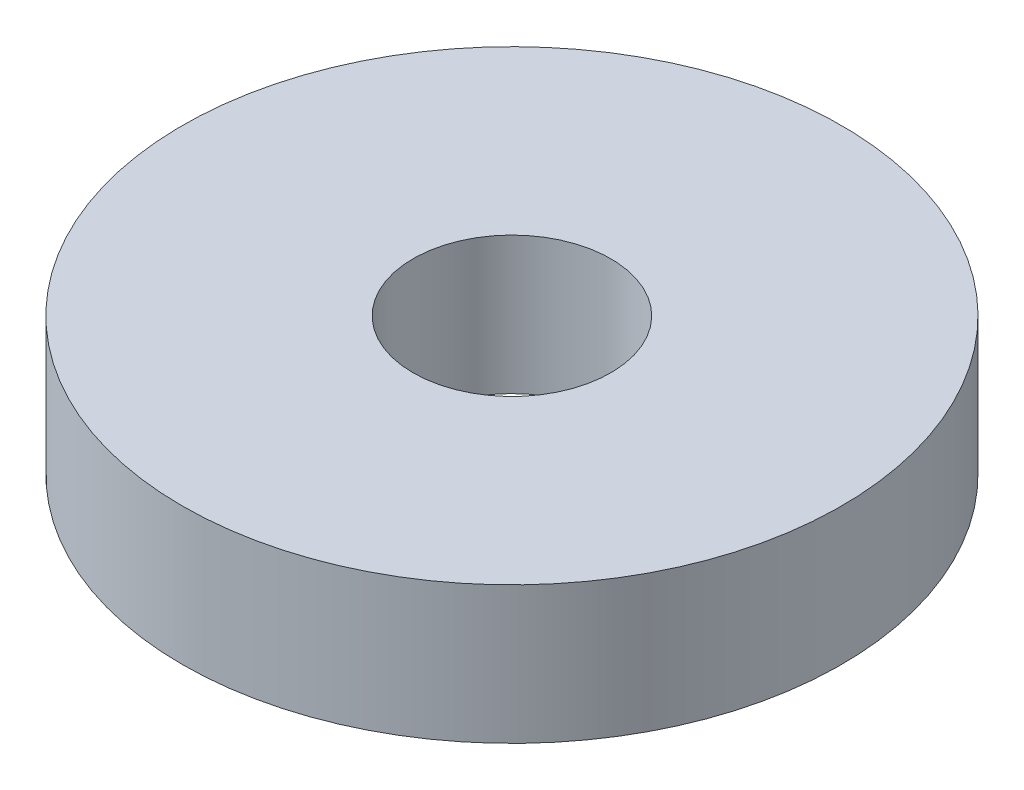
ISO-10303-21;
HEADER;
FILE_DESCRIPTION(('STEP AP214'),'2;1');
FILE_NAME('part.step','',(''),(''),'','','');
FILE_SCHEMA(('AUTOMOTIVE_DESIGN { 1 0 10303 214 1 1 1 1 }'));
ENDSEC;
DATA;
#1=APPLICATION_CONTEXT('core data for automotive mechanical design processes');
#2=APPLICATION_PROTOCOL_DEFINITION('international standard','automotive_design',2000,#1);
#3=PRODUCT_CONTEXT('',#1,'mechanical');
#4=PRODUCT('Part','Part','',(#3));
#5=PRODUCT_RELATED_PRODUCT_CATEGORY('part','',(#4));
#6=PRODUCT_DEFINITION_FORMATION('','',#4);
#7=PRODUCT_DEFINITION_CONTEXT('part definition',#1,'design');
#8=PRODUCT_DEFINITION('design','',#6,#7);
#9=PRODUCT_DEFINITION_SHAPE('','',#8);
#10=(LENGTH_UNIT() NAMED_UNIT(*) SI_UNIT(.MILLI.,.METRE.));
#11=(NAMED_UNIT(*) PLANE_ANGLE_UNIT() SI_UNIT($,.RADIAN.));
#12=(NAMED_UNIT(*) SI_UNIT($,.STERADIAN.) SOLID_ANGLE_UNIT());
#13=UNCERTAINTY_MEASURE_WITH_UNIT(LENGTH_MEASURE(1.E-05),#10,'distance_accuracy_value','');
#14=(GEOMETRIC_REPRESENTATION_CONTEXT(3) GLOBAL_UNCERTAINTY_ASSIGNED_CONTEXT((#13)) GLOBAL_UNIT_ASSIGNED_CONTEXT((#10,
#11,#12)) REPRESENTATION_CONTEXT('',''));
#15=CARTESIAN_POINT('',(0.,0.,0.));
#16=DIRECTION('',(0.,0.,1.));
#17=DIRECTION('',(1.,0.,0.));
#18=AXIS2_PLACEMENT_3D('',#15,#16,#17);
#19=CARTESIAN_POINT('',(0.,2.5,0.));
#20=DIRECTION('',(0.,1.,0.));
#21=DIRECTION('',(0.,0.,1.));
#22=AXIS2_PLACEMENT_3D('',#19,#20,#21);
#23=PLANE('',#22);
#24=CARTESIAN_POINT('',(0.,2.5,0.));
#25=DIRECTION('',(0.,1.,0.));
#26=DIRECTION('',(0.,0.,1.));
#27=AXIS2_PLACEMENT_3D('',#24,#25,#26);
#28=CIRCLE('',#27,6.);
#29=CARTESIAN_POINT('',(0.,2.5,6.));
#30=VERTEX_POINT('',#29);
#31=EDGE_CURVE('E10',#30,#30,#28,.T.);
#32=ORIENTED_EDGE('',*,*,#31,.T.);
#33=EDGE_LOOP('',(#32));
#34=FACE_BOUND('',#33,.T.);
#35=CARTESIAN_POINT('',(0.,2.5,0.));
#36=DIRECTION('',(0.,1.,0.));
#37=DIRECTION('',(0.,0.,1.));
#38=AXIS2_PLACEMENT_3D('',#35,#36,#37);
#39=CIRCLE('',#38,1.8);
#40=CARTESIAN_POINT('',(0.,2.5,1.8));
#41=VERTEX_POINT('',#40);
#42=EDGE_CURVE('E50',#41,#41,#39,.T.);
#43=ORIENTED_EDGE('',*,*,#42,.F.);
#44=EDGE_LOOP('',(#43));
#45=FACE_BOUND('',#44,.T.);
#46=ADVANCED_FACE('F39',(#34,#45),#23,.T.);
#47=CARTESIAN_POINT('',(0.,0.,0.));
#48=DIRECTION('',(0.,1.,0.));
#49=DIRECTION('',(0.,0.,1.));
#50=AXIS2_PLACEMENT_3D('',#47,#48,#49);
#51=PLANE('',#50);
#52=CARTESIAN_POINT('',(0.,0.,0.));
#53=DIRECTION('',(0.,1.,0.));
#54=DIRECTION('',(0.,0.,1.));
#55=AXIS2_PLACEMENT_3D('',#52,#53,#54);
#56=CIRCLE('',#55,6.);
#57=CARTESIAN_POINT('',(0.,0.,6.));
#58=VERTEX_POINT('',#57);
#59=EDGE_CURVE('E43',#58,#58,#56,.T.);
#60=ORIENTED_EDGE('',*,*,#59,.F.);
#61=EDGE_LOOP('',(#60));
#62=FACE_BOUND('',#61,.T.);
#63=CARTESIAN_POINT('',(0.,0.,0.));
#64=DIRECTION('',(0.,1.,0.));
#65=DIRECTION('',(0.,0.,1.));
#66=AXIS2_PLACEMENT_3D('',#63,#64,#65);
#67=CIRCLE('',#66,1.8);
#68=CARTESIAN_POINT('',(0.,0.,1.8));
#69=VERTEX_POINT('',#68);
#70=EDGE_CURVE('E52',#69,#69,#67,.T.);
#71=ORIENTED_EDGE('',*,*,#70,.T.);
#72=EDGE_LOOP('',(#71));
#73=FACE_BOUND('',#72,.T.);
#74=ADVANCED_FACE('F62',(#62,#73),#51,.F.);
#75=CARTESIAN_POINT('',(0.,2.5,0.));
#76=DIRECTION('',(0.,-1.,0.));
#77=DIRECTION('',(0.,0.,-1.));
#78=AXIS2_PLACEMENT_3D('',#75,#76,#77);
#79=CYLINDRICAL_SURFACE('',#78,6.);
#80=ORIENTED_EDGE('',*,*,#31,.F.);
#81=EDGE_LOOP('',(#80));
#82=FACE_BOUND('',#81,.T.);
#83=ORIENTED_EDGE('',*,*,#59,.T.);
#84=EDGE_LOOP('',(#83));
#85=FACE_BOUND('',#84,.T.);
#86=ADVANCED_FACE('F41',(#82,#85),#79,.T.);
#87=CARTESIAN_POINT('',(0.,2.5,0.));
#88=DIRECTION('',(0.,-1.,0.));
#89=DIRECTION('',(0.,0.,-1.));
#90=AXIS2_PLACEMENT_3D('',#87,#88,#89);
#91=CYLINDRICAL_SURFACE('',#90,1.8);
#92=ORIENTED_EDGE('',*,*,#42,.T.);
#93=EDGE_LOOP('',(#92));
#94=FACE_BOUND('',#93,.T.);
#95=ORIENTED_EDGE('',*,*,#70,.F.);
#96=EDGE_LOOP('',(#95));
#97=FACE_BOUND('',#96,.T.);
#98=ADVANCED_FACE('F58',(#94,#97),#91,.F.);
#99=CLOSED_SHELL('',(#46,#74,#86,#98));
#100=MANIFOLD_SOLID_BREP('B2',#99);
#101=ADVANCED_BREP_SHAPE_REPRESENTATION('',(#18,#100),#14);
#102=SHAPE_DEFINITION_REPRESENTATION(#9,#101);
ENDSEC;
END-ISO-10303-21;
